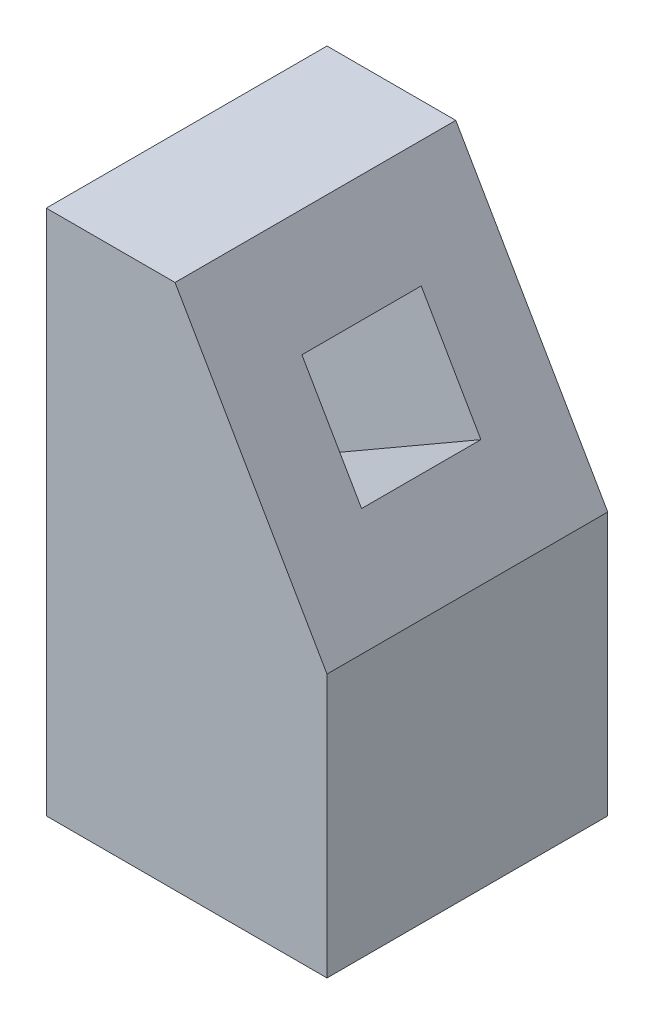
ISO-10303-21;
HEADER;
FILE_DESCRIPTION(('STEP AP214'),'2;1');
FILE_NAME('part.step','',(''),(''),'','','');
FILE_SCHEMA(('AUTOMOTIVE_DESIGN { 1 0 10303 214 1 1 1 1 }'));
ENDSEC;
DATA;
#1=APPLICATION_CONTEXT('core data for automotive mechanical design processes');
#2=APPLICATION_PROTOCOL_DEFINITION('international standard','automotive_design',2000,#1);
#3=PRODUCT_CONTEXT('',#1,'mechanical');
#4=PRODUCT('Part','Part','',(#3));
#5=PRODUCT_RELATED_PRODUCT_CATEGORY('part','',(#4));
#6=PRODUCT_DEFINITION_FORMATION('','',#4);
#7=PRODUCT_DEFINITION_CONTEXT('part definition',#1,'design');
#8=PRODUCT_DEFINITION('design','',#6,#7);
#9=PRODUCT_DEFINITION_SHAPE('','',#8);
#10=(LENGTH_UNIT() NAMED_UNIT(*) SI_UNIT(.MILLI.,.METRE.));
#11=(NAMED_UNIT(*) PLANE_ANGLE_UNIT() SI_UNIT($,.RADIAN.));
#12=(NAMED_UNIT(*) SI_UNIT($,.STERADIAN.) SOLID_ANGLE_UNIT());
#13=UNCERTAINTY_MEASURE_WITH_UNIT(LENGTH_MEASURE(1.E-05),#10,'distance_accuracy_value','');
#14=(GEOMETRIC_REPRESENTATION_CONTEXT(3) GLOBAL_UNCERTAINTY_ASSIGNED_CONTEXT((#13)) GLOBAL_UNIT_ASSIGNED_CONTEXT((#10,
#11,#12)) REPRESENTATION_CONTEXT('',''));
#15=CARTESIAN_POINT('',(0.,0.,0.));
#16=DIRECTION('',(0.,0.,1.));
#17=DIRECTION('',(1.,0.,0.));
#18=AXIS2_PLACEMENT_3D('',#15,#16,#17);
#19=CARTESIAN_POINT('',(0.,15.,0.));
#20=DIRECTION('',(1.,0.,0.));
#21=DIRECTION('',(0.,0.,-1.));
#22=AXIS2_PLACEMENT_3D('',#19,#20,#21);
#23=PLANE('',#22);
#24=DIRECTION('',(0.,-1.,0.));
#25=VECTOR('',#24,1.);
#26=CARTESIAN_POINT('',(0.,15.,-2.3));
#27=LINE('',#26,#25);
#28=CARTESIAN_POINT('',(0.,9.84418876172775,-2.3));
#29=VERTEX_POINT('',#28);
#30=CARTESIAN_POINT('',(0.,5.9182069312383,-2.3));
#31=VERTEX_POINT('',#30);
#32=EDGE_CURVE('E156',#29,#31,#27,.T.);
#33=ORIENTED_EDGE('',*,*,#32,.T.);
#34=DIRECTION('',(0.,0.,-1.));
#35=VECTOR('',#34,1.);
#36=CARTESIAN_POINT('',(0.,5.9182069312383,0.));
#37=LINE('',#36,#35);
#38=CARTESIAN_POINT('',(0.,5.9182069312383,-5.7));
#39=VERTEX_POINT('',#38);
#40=EDGE_CURVE('E160',#31,#39,#37,.T.);
#41=ORIENTED_EDGE('',*,*,#40,.T.);
#42=DIRECTION('',(0.,1.,0.));
#43=VECTOR('',#42,1.);
#44=CARTESIAN_POINT('',(0.,15.,-5.7));
#45=LINE('',#44,#43);
#46=CARTESIAN_POINT('',(0.,9.84418876172774,-5.7));
#47=VERTEX_POINT('',#46);
#48=EDGE_CURVE('E147',#39,#47,#45,.T.);
#49=ORIENTED_EDGE('',*,*,#48,.T.);
#50=DIRECTION('',(0.,0.,1.));
#51=VECTOR('',#50,1.);
#52=CARTESIAN_POINT('',(0.,9.84418876172775,0.));
#53=LINE('',#52,#51);
#54=EDGE_CURVE('E122',#47,#29,#53,.T.);
#55=ORIENTED_EDGE('',*,*,#54,.T.);
#56=EDGE_LOOP('',(#33,#41,#49,#55));
#57=FACE_BOUND('',#56,.T.);
#58=DIRECTION('',(0.,0.,1.));
#59=VECTOR('',#58,1.);
#60=CARTESIAN_POINT('',(0.,0.,0.));
#61=LINE('',#60,#59);
#62=CARTESIAN_POINT('',(0.,0.,-8.));
#63=VERTEX_POINT('',#62);
#64=CARTESIAN_POINT('',(0.,0.,0.));
#65=VERTEX_POINT('',#64);
#66=EDGE_CURVE('E177',#63,#65,#61,.T.);
#67=ORIENTED_EDGE('',*,*,#66,.T.);
#68=DIRECTION('',(0.,-1.,0.));
#69=VECTOR('',#68,1.);
#70=CARTESIAN_POINT('',(0.,15.,0.));
#71=LINE('',#70,#69);
#72=CARTESIAN_POINT('',(0.,15.,0.));
#73=VERTEX_POINT('',#72);
#74=EDGE_CURVE('E11',#73,#65,#71,.T.);
#75=ORIENTED_EDGE('',*,*,#74,.F.);
#76=DIRECTION('',(0.,0.,1.));
#77=VECTOR('',#76,1.);
#78=CARTESIAN_POINT('',(0.,15.,0.));
#79=LINE('',#78,#77);
#80=CARTESIAN_POINT('',(0.,15.,-8.));
#81=VERTEX_POINT('',#80);
#82=EDGE_CURVE('E178',#81,#73,#79,.T.);
#83=ORIENTED_EDGE('',*,*,#82,.F.);
#84=DIRECTION('',(0.,-1.,0.));
#85=VECTOR('',#84,1.);
#86=CARTESIAN_POINT('',(0.,15.,-8.));
#87=LINE('',#86,#85);
#88=EDGE_CURVE('E190',#81,#63,#87,.T.);
#89=ORIENTED_EDGE('',*,*,#88,.T.);
#90=EDGE_LOOP('',(#67,#75,#83,#89));
#91=FACE_BOUND('',#90,.T.);
#92=ADVANCED_FACE('F45',(#57,#91),#23,.F.);
#93=CARTESIAN_POINT('',(0.,15.,0.));
#94=DIRECTION('',(0.,0.,-1.));
#95=DIRECTION('',(-1.,0.,0.));
#96=AXIS2_PLACEMENT_3D('',#93,#94,#95);
#97=PLANE('',#96);
#98=DIRECTION('',(0.,-1.,0.));
#99=VECTOR('',#98,1.);
#100=CARTESIAN_POINT('',(8.,15.,0.));
#101=LINE('',#100,#99);
#102=CARTESIAN_POINT('',(8.,7.5,0.));
#103=VERTEX_POINT('',#102);
#104=CARTESIAN_POINT('',(8.,0.,0.));
#105=VERTEX_POINT('',#104);
#106=EDGE_CURVE('E53',#103,#105,#101,.T.);
#107=ORIENTED_EDGE('',*,*,#106,.F.);
#108=DIRECTION('',(0.499999999999995,-0.866025403784442,0.));
#109=VECTOR('',#108,1.);
#110=CARTESIAN_POINT('',(8.,7.5,0.));
#111=LINE('',#110,#109);
#112=CARTESIAN_POINT('',(3.66987298107787,15.,0.));
#113=VERTEX_POINT('',#112);
#114=EDGE_CURVE('E172',#113,#103,#111,.T.);
#115=ORIENTED_EDGE('',*,*,#114,.F.);
#116=DIRECTION('',(1.,0.,0.));
#117=VECTOR('',#116,1.);
#118=CARTESIAN_POINT('',(0.,15.,0.));
#119=LINE('',#118,#117);
#120=EDGE_CURVE('E182',#73,#113,#119,.T.);
#121=ORIENTED_EDGE('',*,*,#120,.F.);
#122=ORIENTED_EDGE('',*,*,#74,.T.);
#123=DIRECTION('',(1.,0.,0.));
#124=VECTOR('',#123,1.);
#125=CARTESIAN_POINT('',(0.,0.,0.));
#126=LINE('',#125,#124);
#127=EDGE_CURVE('E194',#65,#105,#126,.T.);
#128=ORIENTED_EDGE('',*,*,#127,.T.);
#129=EDGE_LOOP('',(#107,#115,#121,#122,#128));
#130=FACE_BOUND('',#129,.T.);
#131=ADVANCED_FACE('F219',(#130),#97,.F.);
#132=CARTESIAN_POINT('',(8.,15.,0.));
#133=DIRECTION('',(-1.,0.,0.));
#134=DIRECTION('',(0.,0.,1.));
#135=AXIS2_PLACEMENT_3D('',#132,#133,#134);
#136=PLANE('',#135);
#137=DIRECTION('',(0.,-1.,0.));
#138=VECTOR('',#137,1.);
#139=CARTESIAN_POINT('',(8.,15.,-8.));
#140=LINE('',#139,#138);
#141=CARTESIAN_POINT('',(8.,7.5,-8.));
#142=VERTEX_POINT('',#141);
#143=CARTESIAN_POINT('',(8.,0.,-8.));
#144=VERTEX_POINT('',#143);
#145=EDGE_CURVE('E207',#142,#144,#140,.T.);
#146=ORIENTED_EDGE('',*,*,#145,.F.);
#147=DIRECTION('',(0.,0.,-1.));
#148=VECTOR('',#147,1.);
#149=CARTESIAN_POINT('',(8.,7.5,0.000999999999999265));
#150=LINE('',#149,#148);
#151=EDGE_CURVE('E167',#103,#142,#150,.T.);
#152=ORIENTED_EDGE('',*,*,#151,.F.);
#153=ORIENTED_EDGE('',*,*,#106,.T.);
#154=DIRECTION('',(0.,0.,-1.));
#155=VECTOR('',#154,1.);
#156=CARTESIAN_POINT('',(8.,0.,0.));
#157=LINE('',#156,#155);
#158=EDGE_CURVE('E198',#105,#144,#157,.T.);
#159=ORIENTED_EDGE('',*,*,#158,.T.);
#160=EDGE_LOOP('',(#146,#152,#153,#159));
#161=FACE_BOUND('',#160,.T.);
#162=ADVANCED_FACE('F214',(#161),#136,.F.);
#163=CARTESIAN_POINT('',(0.,15.,-8.));
#164=DIRECTION('',(0.,0.,1.));
#165=DIRECTION('',(1.,0.,0.));
#166=AXIS2_PLACEMENT_3D('',#163,#164,#165);
#167=PLANE('',#166);
#168=DIRECTION('',(-1.,0.,0.));
#169=VECTOR('',#168,1.);
#170=CARTESIAN_POINT('',(0.,15.,-8.));
#171=LINE('',#170,#169);
#172=CARTESIAN_POINT('',(3.66987298107787,15.,-8.));
#173=VERTEX_POINT('',#172);
#174=EDGE_CURVE('E187',#173,#81,#171,.T.);
#175=ORIENTED_EDGE('',*,*,#174,.F.);
#176=DIRECTION('',(-0.499999999999995,0.866025403784442,0.));
#177=VECTOR('',#176,1.);
#178=CARTESIAN_POINT('',(8.,7.5,-8.));
#179=LINE('',#178,#177);
#180=EDGE_CURVE('E164',#142,#173,#179,.T.);
#181=ORIENTED_EDGE('',*,*,#180,.F.);
#182=ORIENTED_EDGE('',*,*,#145,.T.);
#183=DIRECTION('',(-1.,0.,0.));
#184=VECTOR('',#183,1.);
#185=CARTESIAN_POINT('',(0.,0.,-8.));
#186=LINE('',#185,#184);
#187=EDGE_CURVE('E183',#144,#63,#186,.T.);
#188=ORIENTED_EDGE('',*,*,#187,.T.);
#189=ORIENTED_EDGE('',*,*,#88,.F.);
#190=EDGE_LOOP('',(#175,#181,#182,#188,#189));
#191=FACE_BOUND('',#190,.T.);
#192=ADVANCED_FACE('F227',(#191),#167,.F.);
#193=CARTESIAN_POINT('',(0.,15.,0.));
#194=DIRECTION('',(0.,-1.,0.));
#195=DIRECTION('',(0.,0.,-1.));
#196=AXIS2_PLACEMENT_3D('',#193,#194,#195);
#197=PLANE('',#196);
#198=ORIENTED_EDGE('',*,*,#120,.T.);
#199=DIRECTION('',(0.,0.,-1.));
#200=VECTOR('',#199,1.);
#201=CARTESIAN_POINT('',(3.66987298107787,15.,0.000999999999999265));
#202=LINE('',#201,#200);
#203=EDGE_CURVE('E168',#113,#173,#202,.T.);
#204=ORIENTED_EDGE('',*,*,#203,.T.);
#205=ORIENTED_EDGE('',*,*,#174,.T.);
#206=ORIENTED_EDGE('',*,*,#82,.T.);
#207=EDGE_LOOP('',(#198,#204,#205,#206));
#208=FACE_BOUND('',#207,.T.);
#209=ADVANCED_FACE('F232',(#208),#197,.F.);
#210=CARTESIAN_POINT('',(0.,0.,0.));
#211=DIRECTION('',(0.,-1.,0.));
#212=DIRECTION('',(0.,0.,-1.));
#213=AXIS2_PLACEMENT_3D('',#210,#211,#212);
#214=PLANE('',#213);
#215=ORIENTED_EDGE('',*,*,#66,.F.);
#216=ORIENTED_EDGE('',*,*,#187,.F.);
#217=ORIENTED_EDGE('',*,*,#158,.F.);
#218=ORIENTED_EDGE('',*,*,#127,.F.);
#219=EDGE_LOOP('',(#215,#216,#217,#218));
#220=FACE_BOUND('',#219,.T.);
#221=ADVANCED_FACE('F223',(#220),#214,.T.);
#222=CARTESIAN_POINT('',(8.,7.5,0.000999999999999265));
#223=DIRECTION('',(-0.866025403784442,-0.499999999999995,0.));
#224=DIRECTION('',(0.499999999999995,-0.866025403784442,0.));
#225=AXIS2_PLACEMENT_3D('',#222,#223,#224);
#226=PLANE('',#225);
#227=DIRECTION('',(-0.499999999999995,0.866025403784442,0.));
#228=VECTOR('',#227,1.);
#229=CARTESIAN_POINT('',(4.98493649053894,12.7222431864336,-5.7));
#230=LINE('',#229,#228);
#231=CARTESIAN_POINT('',(6.68493649053893,9.77775681356645,-5.7));
#232=VERTEX_POINT('',#231);
#233=CARTESIAN_POINT('',(4.98493649053894,12.7222431864336,-5.7));
#234=VERTEX_POINT('',#233);
#235=EDGE_CURVE('E129',#232,#234,#230,.T.);
#236=ORIENTED_EDGE('',*,*,#235,.F.);
#237=DIRECTION('',(0.,0.,-1.));
#238=VECTOR('',#237,1.);
#239=CARTESIAN_POINT('',(6.68493649053893,9.77775681356645,-5.7));
#240=LINE('',#239,#238);
#241=CARTESIAN_POINT('',(6.68493649053893,9.77775681356645,-2.3));
#242=VERTEX_POINT('',#241);
#243=EDGE_CURVE('E68',#242,#232,#240,.T.);
#244=ORIENTED_EDGE('',*,*,#243,.F.);
#245=DIRECTION('',(0.499999999999995,-0.866025403784442,0.));
#246=VECTOR('',#245,1.);
#247=CARTESIAN_POINT('',(4.98493649053894,12.7222431864336,-2.3));
#248=LINE('',#247,#246);
#249=CARTESIAN_POINT('',(4.98493649053894,12.7222431864336,-2.3));
#250=VERTEX_POINT('',#249);
#251=EDGE_CURVE('E137',#250,#242,#248,.T.);
#252=ORIENTED_EDGE('',*,*,#251,.F.);
#253=DIRECTION('',(0.,0.,1.));
#254=VECTOR('',#253,1.);
#255=CARTESIAN_POINT('',(4.98493649053894,12.7222431864336,-5.7));
#256=LINE('',#255,#254);
#257=EDGE_CURVE('E119',#234,#250,#256,.T.);
#258=ORIENTED_EDGE('',*,*,#257,.F.);
#259=EDGE_LOOP('',(#236,#244,#252,#258));
#260=FACE_BOUND('',#259,.T.);
#261=ORIENTED_EDGE('',*,*,#114,.T.);
#262=ORIENTED_EDGE('',*,*,#151,.T.);
#263=ORIENTED_EDGE('',*,*,#180,.T.);
#264=ORIENTED_EDGE('',*,*,#203,.F.);
#265=EDGE_LOOP('',(#261,#262,#263,#264));
#266=FACE_BOUND('',#265,.T.);
#267=ADVANCED_FACE('F134',(#260,#266),#226,.F.);
#268=CARTESIAN_POINT('',(-1.97531754730549,4.7777568135665,-5.7));
#269=DIRECTION('',(0.499999999999995,-0.866025403784442,0.));
#270=DIRECTION('',(0.866025403784442,0.499999999999995,0.));
#271=AXIS2_PLACEMENT_3D('',#268,#269,#270);
#272=PLANE('',#271);
#273=DIRECTION('',(0.866025403784442,0.499999999999995,0.));
#274=VECTOR('',#273,1.);
#275=CARTESIAN_POINT('',(-1.97531754730549,4.7777568135665,-2.3));
#276=LINE('',#275,#274);
#277=EDGE_CURVE('E144',#31,#242,#276,.T.);
#278=ORIENTED_EDGE('',*,*,#277,.T.);
#279=ORIENTED_EDGE('',*,*,#243,.T.);
#280=DIRECTION('',(0.866025403784442,0.499999999999995,0.));
#281=VECTOR('',#280,1.);
#282=CARTESIAN_POINT('',(-1.97531754730549,4.7777568135665,-5.7));
#283=LINE('',#282,#281);
#284=EDGE_CURVE('E126',#39,#232,#283,.T.);
#285=ORIENTED_EDGE('',*,*,#284,.F.);
#286=ORIENTED_EDGE('',*,*,#40,.F.);
#287=EDGE_LOOP('',(#278,#279,#285,#286));
#288=FACE_BOUND('',#287,.T.);
#289=ADVANCED_FACE('F234',(#288),#272,.F.);
#290=CARTESIAN_POINT('',(-3.67531754730548,7.7222431864336,-2.3));
#291=DIRECTION('',(0.,0.,1.));
#292=DIRECTION('',(1.,0.,0.));
#293=AXIS2_PLACEMENT_3D('',#290,#291,#292);
#294=PLANE('',#293);
#295=DIRECTION('',(0.866025403784442,0.499999999999995,0.));
#296=VECTOR('',#295,1.);
#297=CARTESIAN_POINT('',(-3.67531754730548,7.7222431864336,-2.3));
#298=LINE('',#297,#296);
#299=EDGE_CURVE('E125',#29,#250,#298,.T.);
#300=ORIENTED_EDGE('',*,*,#299,.T.);
#301=ORIENTED_EDGE('',*,*,#251,.T.);
#302=ORIENTED_EDGE('',*,*,#277,.F.);
#303=ORIENTED_EDGE('',*,*,#32,.F.);
#304=EDGE_LOOP('',(#300,#301,#302,#303));
#305=FACE_BOUND('',#304,.T.);
#306=ADVANCED_FACE('F240',(#305),#294,.F.);
#307=CARTESIAN_POINT('',(-3.67531754730548,7.7222431864336,-5.7));
#308=DIRECTION('',(-0.499999999999995,0.866025403784442,0.));
#309=DIRECTION('',(-0.866025403784442,-0.499999999999995,0.));
#310=AXIS2_PLACEMENT_3D('',#307,#308,#309);
#311=PLANE('',#310);
#312=DIRECTION('',(0.866025403784442,0.499999999999995,0.));
#313=VECTOR('',#312,1.);
#314=CARTESIAN_POINT('',(-3.67531754730548,7.7222431864336,-5.7));
#315=LINE('',#314,#313);
#316=EDGE_CURVE('E60',#47,#234,#315,.T.);
#317=ORIENTED_EDGE('',*,*,#316,.T.);
#318=ORIENTED_EDGE('',*,*,#257,.T.);
#319=ORIENTED_EDGE('',*,*,#299,.F.);
#320=ORIENTED_EDGE('',*,*,#54,.F.);
#321=EDGE_LOOP('',(#317,#318,#319,#320));
#322=FACE_BOUND('',#321,.T.);
#323=ADVANCED_FACE('F116',(#322),#311,.F.);
#324=CARTESIAN_POINT('',(-3.67531754730548,7.7222431864336,-5.7));
#325=DIRECTION('',(0.,0.,-1.));
#326=DIRECTION('',(-1.,0.,0.));
#327=AXIS2_PLACEMENT_3D('',#324,#325,#326);
#328=PLANE('',#327);
#329=ORIENTED_EDGE('',*,*,#284,.T.);
#330=ORIENTED_EDGE('',*,*,#235,.T.);
#331=ORIENTED_EDGE('',*,*,#316,.F.);
#332=ORIENTED_EDGE('',*,*,#48,.F.);
#333=EDGE_LOOP('',(#329,#330,#331,#332));
#334=FACE_BOUND('',#333,.T.);
#335=ADVANCED_FACE('F130',(#334),#328,.F.);
#336=CLOSED_SHELL('',(#92,#131,#162,#192,#209,#221,#267,#289,#306,#323,#335));
#337=MANIFOLD_SOLID_BREP('B2',#336);
#338=ADVANCED_BREP_SHAPE_REPRESENTATION('',(#18,#337),#14);
#339=SHAPE_DEFINITION_REPRESENTATION(#9,#338);
ENDSEC;
END-ISO-10303-21;
